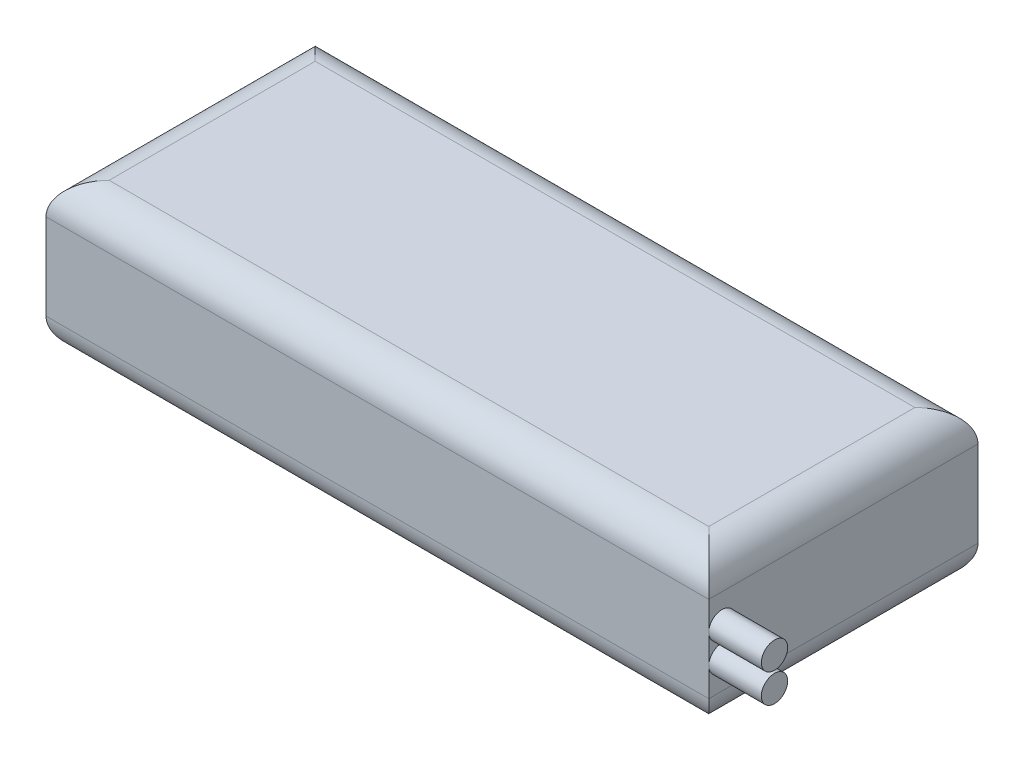
ISO-10303-21;
HEADER;
FILE_DESCRIPTION(('STEP AP214'),'2;1');
FILE_NAME('part.step','',(''),(''),'','','');
FILE_SCHEMA(('AUTOMOTIVE_DESIGN { 1 0 10303 214 1 1 1 1 }'));
ENDSEC;
DATA;
#1=APPLICATION_CONTEXT('core data for automotive mechanical design processes');
#2=APPLICATION_PROTOCOL_DEFINITION('international standard','automotive_design',2000,#1);
#3=PRODUCT_CONTEXT('',#1,'mechanical');
#4=PRODUCT('Part','Part','',(#3));
#5=PRODUCT_RELATED_PRODUCT_CATEGORY('part','',(#4));
#6=PRODUCT_DEFINITION_FORMATION('','',#4);
#7=PRODUCT_DEFINITION_CONTEXT('part definition',#1,'design');
#8=PRODUCT_DEFINITION('design','',#6,#7);
#9=PRODUCT_DEFINITION_SHAPE('','',#8);
#10=(LENGTH_UNIT() NAMED_UNIT(*) SI_UNIT(.MILLI.,.METRE.));
#11=(NAMED_UNIT(*) PLANE_ANGLE_UNIT() SI_UNIT($,.RADIAN.));
#12=(NAMED_UNIT(*) SI_UNIT($,.STERADIAN.) SOLID_ANGLE_UNIT());
#13=UNCERTAINTY_MEASURE_WITH_UNIT(LENGTH_MEASURE(1.E-05),#10,'distance_accuracy_value','');
#14=(GEOMETRIC_REPRESENTATION_CONTEXT(3) GLOBAL_UNCERTAINTY_ASSIGNED_CONTEXT((#13)) GLOBAL_UNIT_ASSIGNED_CONTEXT((#10,
#11,#12)) REPRESENTATION_CONTEXT('',''));
#15=CARTESIAN_POINT('',(0.,0.,0.));
#16=DIRECTION('',(0.,0.,1.));
#17=DIRECTION('',(1.,0.,0.));
#18=AXIS2_PLACEMENT_3D('',#15,#16,#17);
#19=CARTESIAN_POINT('',(-41.0839694656488,36.,-17.2442748091603));
#20=DIRECTION('',(1.,0.,0.));
#21=DIRECTION('',(0.,0.,-1.));
#22=AXIS2_PLACEMENT_3D('',#19,#20,#21);
#23=PLANE('',#22);
#24=DIRECTION('',(0.,-1.,0.));
#25=VECTOR('',#24,1.);
#26=CARTESIAN_POINT('',(-41.0839694656488,36.,-17.2442748091603));
#27=LINE('',#26,#25);
#28=CARTESIAN_POINT('',(-41.0839694656488,28.38,-17.2442748091603));
#29=VERTEX_POINT('',#28);
#30=CARTESIAN_POINT('',(-41.0839694656488,7.62,-17.2442748091603));
#31=VERTEX_POINT('',#30);
#32=EDGE_CURVE('E124',#29,#31,#27,.T.);
#33=ORIENTED_EDGE('',*,*,#32,.T.);
#34=DIRECTION('',(0.,0.,1.));
#35=VECTOR('',#34,1.);
#36=CARTESIAN_POINT('',(-41.0839694656488,7.62,-17.2442748091603));
#37=LINE('',#36,#35);
#38=CARTESIAN_POINT('',(-41.0839694656488,7.62,47.7557251908397));
#39=VERTEX_POINT('',#38);
#40=EDGE_CURVE('E154',#31,#39,#37,.T.);
#41=ORIENTED_EDGE('',*,*,#40,.T.);
#42=DIRECTION('',(0.,-1.,0.));
#43=VECTOR('',#42,1.);
#44=CARTESIAN_POINT('',(-41.0839694656488,36.,47.7557251908397));
#45=LINE('',#44,#43);
#46=CARTESIAN_POINT('',(-41.0839694656488,28.38,47.7557251908397));
#47=VERTEX_POINT('',#46);
#48=EDGE_CURVE('E127',#47,#39,#45,.T.);
#49=ORIENTED_EDGE('',*,*,#48,.F.);
#50=DIRECTION('',(0.,0.,1.));
#51=VECTOR('',#50,1.);
#52=CARTESIAN_POINT('',(-41.0839694656488,28.38,-17.2442748091603));
#53=LINE('',#52,#51);
#54=EDGE_CURVE('E152',#47,#29,#53,.F.);
#55=ORIENTED_EDGE('',*,*,#54,.T.);
#56=EDGE_LOOP('',(#33,#41,#49,#55));
#57=FACE_BOUND('',#56,.T.);
#58=ADVANCED_FACE('F32',(#57),#23,.F.);
#59=CARTESIAN_POINT('',(-41.0839694656488,36.,47.7557251908397));
#60=DIRECTION('',(0.,0.,-1.));
#61=DIRECTION('',(-1.,0.,0.));
#62=AXIS2_PLACEMENT_3D('',#59,#60,#61);
#63=PLANE('',#62);
#64=ORIENTED_EDGE('',*,*,#48,.T.);
#65=DIRECTION('',(1.,0.,0.));
#66=VECTOR('',#65,1.);
#67=CARTESIAN_POINT('',(-41.0839694656488,7.62,47.7557251908397));
#68=LINE('',#67,#66);
#69=CARTESIAN_POINT('',(118.916030534351,7.62,47.7557251908397));
#70=VERTEX_POINT('',#69);
#71=EDGE_CURVE('E121',#39,#70,#68,.T.);
#72=ORIENTED_EDGE('',*,*,#71,.T.);
#73=DIRECTION('',(0.,-1.,0.));
#74=VECTOR('',#73,1.);
#75=CARTESIAN_POINT('',(118.916030534351,36.,47.7557251908397));
#76=LINE('',#75,#74);
#77=CARTESIAN_POINT('',(118.916030534351,14.5075,47.7557251908397));
#78=VERTEX_POINT('',#77);
#79=EDGE_CURVE('E115',#78,#70,#76,.T.);
#80=ORIENTED_EDGE('',*,*,#79,.F.);
#81=CARTESIAN_POINT('',(118.916030534351,21.4925,47.7557251908397));
#82=VERTEX_POINT('',#81);
#83=EDGE_CURVE('E104',#82,#78,#76,.T.);
#84=ORIENTED_EDGE('',*,*,#83,.F.);
#85=CARTESIAN_POINT('',(118.916030534351,28.38,47.7557251908397));
#86=VERTEX_POINT('',#85);
#87=EDGE_CURVE('E114',#86,#82,#76,.T.);
#88=ORIENTED_EDGE('',*,*,#87,.F.);
#89=DIRECTION('',(1.,0.,0.));
#90=VECTOR('',#89,1.);
#91=CARTESIAN_POINT('',(-41.0839694656488,28.38,47.7557251908397));
#92=LINE('',#91,#90);
#93=EDGE_CURVE('E128',#86,#47,#92,.F.);
#94=ORIENTED_EDGE('',*,*,#93,.T.);
#95=EDGE_LOOP('',(#64,#72,#80,#84,#88,#94));
#96=FACE_BOUND('',#95,.T.);
#97=ADVANCED_FACE('F119',(#96),#63,.F.);
#98=CARTESIAN_POINT('',(118.916030534351,36.,-17.2442748091603));
#99=DIRECTION('',(-1.,0.,0.));
#100=DIRECTION('',(0.,0.,1.));
#101=AXIS2_PLACEMENT_3D('',#98,#99,#100);
#102=PLANE('',#101);
#103=ORIENTED_EDGE('',*,*,#79,.T.);
#104=DIRECTION('',(0.,0.,-1.));
#105=VECTOR('',#104,1.);
#106=CARTESIAN_POINT('',(118.916030534351,7.62,-17.2442748091603));
#107=LINE('',#106,#105);
#108=CARTESIAN_POINT('',(118.916030534351,7.62,-17.2442748091603));
#109=VERTEX_POINT('',#108);
#110=EDGE_CURVE('E145',#70,#109,#107,.T.);
#111=ORIENTED_EDGE('',*,*,#110,.T.);
#112=DIRECTION('',(0.,-1.,0.));
#113=VECTOR('',#112,1.);
#114=CARTESIAN_POINT('',(118.916030534351,36.,-17.2442748091603));
#115=LINE('',#114,#113);
#116=CARTESIAN_POINT('',(118.916030534351,28.38,-17.2442748091603));
#117=VERTEX_POINT('',#116);
#118=EDGE_CURVE('E122',#117,#109,#115,.T.);
#119=ORIENTED_EDGE('',*,*,#118,.F.);
#120=DIRECTION('',(0.,0.,-1.));
#121=VECTOR('',#120,1.);
#122=CARTESIAN_POINT('',(118.916030534351,28.38,47.7557251908397));
#123=LINE('',#122,#121);
#124=EDGE_CURVE('E143',#117,#86,#123,.F.);
#125=ORIENTED_EDGE('',*,*,#124,.T.);
#126=ORIENTED_EDGE('',*,*,#87,.T.);
#127=CARTESIAN_POINT('',(118.916030534351,21.4925,44.5807251908397));
#128=DIRECTION('',(1.,0.,0.));
#129=DIRECTION('',(0.,0.,-1.));
#130=AXIS2_PLACEMENT_3D('',#127,#128,#129);
#131=CIRCLE('',#130,3.175);
#132=EDGE_CURVE('E111',#82,#82,#131,.T.);
#133=ORIENTED_EDGE('',*,*,#132,.F.);
#134=ORIENTED_EDGE('',*,*,#83,.T.);
#135=CARTESIAN_POINT('',(118.916030534351,14.5075,44.5807251908397));
#136=DIRECTION('',(1.,0.,0.));
#137=DIRECTION('',(0.,0.,-1.));
#138=AXIS2_PLACEMENT_3D('',#135,#136,#137);
#139=CIRCLE('',#138,3.175);
#140=EDGE_CURVE('E109',#78,#78,#139,.T.);
#141=ORIENTED_EDGE('',*,*,#140,.F.);
#142=EDGE_LOOP('',(#103,#111,#119,#125,#126,#133,#134,#141));
#143=FACE_BOUND('',#142,.T.);
#144=ADVANCED_FACE('F107',(#143),#102,.F.);
#145=CARTESIAN_POINT('',(-41.0839694656488,36.,-17.2442748091603));
#146=DIRECTION('',(0.,0.,1.));
#147=DIRECTION('',(1.,0.,0.));
#148=AXIS2_PLACEMENT_3D('',#145,#146,#147);
#149=PLANE('',#148);
#150=ORIENTED_EDGE('',*,*,#118,.T.);
#151=DIRECTION('',(-1.,0.,0.));
#152=VECTOR('',#151,1.);
#153=CARTESIAN_POINT('',(-41.0839694656488,7.62,-17.2442748091603));
#154=LINE('',#153,#152);
#155=EDGE_CURVE('E150',#109,#31,#154,.T.);
#156=ORIENTED_EDGE('',*,*,#155,.T.);
#157=ORIENTED_EDGE('',*,*,#32,.F.);
#158=DIRECTION('',(-1.,0.,0.));
#159=VECTOR('',#158,1.);
#160=CARTESIAN_POINT('',(118.916030534351,28.38,-17.2442748091603));
#161=LINE('',#160,#159);
#162=EDGE_CURVE('E147',#29,#117,#161,.F.);
#163=ORIENTED_EDGE('',*,*,#162,.T.);
#164=EDGE_LOOP('',(#150,#156,#157,#163));
#165=FACE_BOUND('',#164,.T.);
#166=ADVANCED_FACE('F205',(#165),#149,.F.);
#167=CARTESIAN_POINT('',(0.,36.,0.));
#168=DIRECTION('',(0.,1.,0.));
#169=DIRECTION('',(0.,0.,1.));
#170=AXIS2_PLACEMENT_3D('',#167,#168,#169);
#171=PLANE('',#170);
#172=DIRECTION('',(0.,0.,-1.));
#173=VECTOR('',#172,1.);
#174=CARTESIAN_POINT('',(111.296030534351,36.,-17.2442748091603));
#175=LINE('',#174,#173);
#176=CARTESIAN_POINT('',(111.296030534351,36.,40.1357251908397));
#177=VERTEX_POINT('',#176);
#178=CARTESIAN_POINT('',(111.296030534351,36.,-9.62427480916031));
#179=VERTEX_POINT('',#178);
#180=EDGE_CURVE('E41',#177,#179,#175,.T.);
#181=ORIENTED_EDGE('',*,*,#180,.T.);
#182=DIRECTION('',(-1.,0.,0.));
#183=VECTOR('',#182,1.);
#184=CARTESIAN_POINT('',(-41.0839694656488,36.,-9.62427480916031));
#185=LINE('',#184,#183);
#186=CARTESIAN_POINT('',(-33.4639694656488,36.,-9.62427480916031));
#187=VERTEX_POINT('',#186);
#188=EDGE_CURVE('E11',#179,#187,#185,.T.);
#189=ORIENTED_EDGE('',*,*,#188,.T.);
#190=DIRECTION('',(0.,0.,1.));
#191=VECTOR('',#190,1.);
#192=CARTESIAN_POINT('',(-33.4639694656488,36.,47.7557251908397));
#193=LINE('',#192,#191);
#194=CARTESIAN_POINT('',(-33.4639694656488,36.,40.1357251908397));
#195=VERTEX_POINT('',#194);
#196=EDGE_CURVE('E156',#187,#195,#193,.T.);
#197=ORIENTED_EDGE('',*,*,#196,.T.);
#198=DIRECTION('',(1.,0.,0.));
#199=VECTOR('',#198,1.);
#200=CARTESIAN_POINT('',(118.916030534351,36.,40.1357251908397));
#201=LINE('',#200,#199);
#202=EDGE_CURVE('E52',#195,#177,#201,.T.);
#203=ORIENTED_EDGE('',*,*,#202,.T.);
#204=EDGE_LOOP('',(#181,#189,#197,#203));
#205=FACE_BOUND('',#204,.T.);
#206=ADVANCED_FACE('F214',(#205),#171,.T.);
#207=CARTESIAN_POINT('',(0.,0.,0.));
#208=DIRECTION('',(0.,1.,0.));
#209=DIRECTION('',(0.,0.,1.));
#210=AXIS2_PLACEMENT_3D('',#207,#208,#209);
#211=PLANE('',#210);
#212=DIRECTION('',(0.,0.,-1.));
#213=VECTOR('',#212,1.);
#214=CARTESIAN_POINT('',(111.296030534351,0.,0.));
#215=LINE('',#214,#213);
#216=CARTESIAN_POINT('',(111.296030534351,0.,-9.62427480916031));
#217=VERTEX_POINT('',#216);
#218=CARTESIAN_POINT('',(111.296030534351,0.,40.1357251908397));
#219=VERTEX_POINT('',#218);
#220=EDGE_CURVE('E138',#217,#219,#215,.F.);
#221=ORIENTED_EDGE('',*,*,#220,.T.);
#222=DIRECTION('',(1.,0.,0.));
#223=VECTOR('',#222,1.);
#224=CARTESIAN_POINT('',(0.,0.,40.1357251908397));
#225=LINE('',#224,#223);
#226=CARTESIAN_POINT('',(-33.4639694656488,0.,40.1357251908397));
#227=VERTEX_POINT('',#226);
#228=EDGE_CURVE('E140',#219,#227,#225,.F.);
#229=ORIENTED_EDGE('',*,*,#228,.T.);
#230=DIRECTION('',(0.,0.,1.));
#231=VECTOR('',#230,1.);
#232=CARTESIAN_POINT('',(-33.4639694656488,0.,0.));
#233=LINE('',#232,#231);
#234=CARTESIAN_POINT('',(-33.4639694656488,0.,-9.62427480916031));
#235=VERTEX_POINT('',#234);
#236=EDGE_CURVE('E134',#227,#235,#233,.F.);
#237=ORIENTED_EDGE('',*,*,#236,.T.);
#238=DIRECTION('',(-1.,0.,0.));
#239=VECTOR('',#238,1.);
#240=CARTESIAN_POINT('',(0.,0.,-9.62427480916031));
#241=LINE('',#240,#239);
#242=EDGE_CURVE('E136',#235,#217,#241,.F.);
#243=ORIENTED_EDGE('',*,*,#242,.T.);
#244=EDGE_LOOP('',(#221,#229,#237,#243));
#245=FACE_BOUND('',#244,.T.);
#246=ADVANCED_FACE('F211',(#245),#211,.F.);
#247=CARTESIAN_POINT('',(131.616030534351,21.4925,44.5807251908397));
#248=DIRECTION('',(-1.,0.,0.));
#249=DIRECTION('',(0.,0.,1.));
#250=AXIS2_PLACEMENT_3D('',#247,#248,#249);
#251=CYLINDRICAL_SURFACE('',#250,3.175);
#252=CARTESIAN_POINT('',(131.616030534351,21.4925,44.5807251908397));
#253=DIRECTION('',(1.,0.,0.));
#254=DIRECTION('',(0.,0.,-1.));
#255=AXIS2_PLACEMENT_3D('',#252,#253,#254);
#256=CIRCLE('',#255,3.175);
#257=CARTESIAN_POINT('',(131.616030534351,21.4925,41.4057251908397));
#258=VERTEX_POINT('',#257);
#259=EDGE_CURVE('E368',#258,#258,#256,.T.);
#260=ORIENTED_EDGE('',*,*,#259,.F.);
#261=EDGE_LOOP('',(#260));
#262=FACE_BOUND('',#261,.T.);
#263=ORIENTED_EDGE('',*,*,#132,.T.);
#264=EDGE_LOOP('',(#263));
#265=FACE_BOUND('',#264,.T.);
#266=ADVANCED_FACE('F213',(#262,#265),#251,.T.);
#267=CARTESIAN_POINT('',(131.616030534351,21.4925,44.5807251908397));
#268=DIRECTION('',(1.,0.,0.));
#269=DIRECTION('',(0.,0.,-1.));
#270=AXIS2_PLACEMENT_3D('',#267,#268,#269);
#271=PLANE('',#270);
#272=ORIENTED_EDGE('',*,*,#259,.T.);
#273=EDGE_LOOP('',(#272));
#274=FACE_BOUND('',#273,.T.);
#275=ADVANCED_FACE('F220',(#274),#271,.T.);
#276=CARTESIAN_POINT('',(131.616030534351,14.5075,44.5807251908397));
#277=DIRECTION('',(-1.,0.,0.));
#278=DIRECTION('',(0.,0.,1.));
#279=AXIS2_PLACEMENT_3D('',#276,#277,#278);
#280=CYLINDRICAL_SURFACE('',#279,3.175);
#281=CARTESIAN_POINT('',(131.616030534351,14.5075,44.5807251908397));
#282=DIRECTION('',(1.,0.,0.));
#283=DIRECTION('',(0.,0.,-1.));
#284=AXIS2_PLACEMENT_3D('',#281,#282,#283);
#285=CIRCLE('',#284,3.175);
#286=CARTESIAN_POINT('',(131.616030534351,14.5075,41.4057251908397));
#287=VERTEX_POINT('',#286);
#288=EDGE_CURVE('E371',#287,#287,#285,.T.);
#289=ORIENTED_EDGE('',*,*,#288,.F.);
#290=EDGE_LOOP('',(#289));
#291=FACE_BOUND('',#290,.T.);
#292=ORIENTED_EDGE('',*,*,#140,.T.);
#293=EDGE_LOOP('',(#292));
#294=FACE_BOUND('',#293,.T.);
#295=ADVANCED_FACE('F276',(#291,#294),#280,.T.);
#296=CARTESIAN_POINT('',(131.616030534351,14.5075,44.5807251908397));
#297=DIRECTION('',(1.,0.,0.));
#298=DIRECTION('',(0.,0.,-1.));
#299=AXIS2_PLACEMENT_3D('',#296,#297,#298);
#300=PLANE('',#299);
#301=ORIENTED_EDGE('',*,*,#288,.T.);
#302=EDGE_LOOP('',(#301));
#303=FACE_BOUND('',#302,.T.);
#304=ADVANCED_FACE('F241',(#303),#300,.T.);
#305=CARTESIAN_POINT('',(-41.0839694656488,7.62,-9.62427480916031));
#306=DIRECTION('',(-1.,0.,0.));
#307=DIRECTION('',(0.,0.,1.));
#308=AXIS2_PLACEMENT_3D('',#305,#306,#307);
#309=CYLINDRICAL_SURFACE('',#308,7.62);
#310=CARTESIAN_POINT('',(111.296030534351,7.62,-9.62427480916031));
#311=DIRECTION('',(-0.707106781186547,0.,-0.707106781186547));
#312=DIRECTION('',(-0.707106781186547,0.,0.707106781186547));
#313=AXIS2_PLACEMENT_3D('',#310,#311,#312);
#314=ELLIPSE('',#313,10.776307345283,7.62);
#315=EDGE_CURVE('E164',#217,#109,#314,.F.);
#316=ORIENTED_EDGE('',*,*,#315,.F.);
#317=ORIENTED_EDGE('',*,*,#242,.F.);
#318=CARTESIAN_POINT('',(-33.4639694656488,7.62,-9.62427480916031));
#319=DIRECTION('',(-0.707106781186547,0.,0.707106781186547));
#320=DIRECTION('',(0.707106781186547,0.,0.707106781186547));
#321=AXIS2_PLACEMENT_3D('',#318,#319,#320);
#322=ELLIPSE('',#321,10.776307345283,7.62);
#323=EDGE_CURVE('E167',#31,#235,#322,.T.);
#324=ORIENTED_EDGE('',*,*,#323,.F.);
#325=ORIENTED_EDGE('',*,*,#155,.F.);
#326=EDGE_LOOP('',(#316,#317,#324,#325));
#327=FACE_BOUND('',#326,.T.);
#328=ADVANCED_FACE('F208',(#327),#309,.T.);
#329=CARTESIAN_POINT('',(-33.4639694656488,7.62,-17.2442748091603));
#330=DIRECTION('',(0.,0.,1.));
#331=DIRECTION('',(1.,0.,0.));
#332=AXIS2_PLACEMENT_3D('',#329,#330,#331);
#333=CYLINDRICAL_SURFACE('',#332,7.62);
#334=ORIENTED_EDGE('',*,*,#323,.T.);
#335=ORIENTED_EDGE('',*,*,#236,.F.);
#336=CARTESIAN_POINT('',(-33.4639694656488,7.62,40.1357251908397));
#337=DIRECTION('',(0.707106781186547,0.,0.707106781186547));
#338=DIRECTION('',(-0.707106781186547,0.,0.707106781186547));
#339=AXIS2_PLACEMENT_3D('',#336,#337,#338);
#340=ELLIPSE('',#339,10.776307345283,7.62);
#341=EDGE_CURVE('E162',#39,#227,#340,.T.);
#342=ORIENTED_EDGE('',*,*,#341,.F.);
#343=ORIENTED_EDGE('',*,*,#40,.F.);
#344=EDGE_LOOP('',(#334,#335,#342,#343));
#345=FACE_BOUND('',#344,.T.);
#346=ADVANCED_FACE('F191',(#345),#333,.T.);
#347=CARTESIAN_POINT('',(111.296030534351,7.62,-17.2442748091603));
#348=DIRECTION('',(0.,0.,-1.));
#349=DIRECTION('',(-1.,0.,0.));
#350=AXIS2_PLACEMENT_3D('',#347,#348,#349);
#351=CYLINDRICAL_SURFACE('',#350,7.62);
#352=ORIENTED_EDGE('',*,*,#315,.T.);
#353=ORIENTED_EDGE('',*,*,#110,.F.);
#354=CARTESIAN_POINT('',(111.296030534351,7.62,40.1357251908397));
#355=DIRECTION('',(0.707106781186547,0.,-0.707106781186547));
#356=DIRECTION('',(-0.707106781186547,0.,-0.707106781186547));
#357=AXIS2_PLACEMENT_3D('',#354,#355,#356);
#358=ELLIPSE('',#357,10.776307345283,7.62);
#359=EDGE_CURVE('E160',#219,#70,#358,.F.);
#360=ORIENTED_EDGE('',*,*,#359,.F.);
#361=ORIENTED_EDGE('',*,*,#220,.F.);
#362=EDGE_LOOP('',(#352,#353,#360,#361));
#363=FACE_BOUND('',#362,.T.);
#364=ADVANCED_FACE('F200',(#363),#351,.T.);
#365=CARTESIAN_POINT('',(-41.0839694656488,7.62,40.1357251908397));
#366=DIRECTION('',(1.,0.,0.));
#367=DIRECTION('',(0.,0.,-1.));
#368=AXIS2_PLACEMENT_3D('',#365,#366,#367);
#369=CYLINDRICAL_SURFACE('',#368,7.62);
#370=ORIENTED_EDGE('',*,*,#341,.T.);
#371=ORIENTED_EDGE('',*,*,#228,.F.);
#372=ORIENTED_EDGE('',*,*,#359,.T.);
#373=ORIENTED_EDGE('',*,*,#71,.F.);
#374=EDGE_LOOP('',(#370,#371,#372,#373));
#375=FACE_BOUND('',#374,.T.);
#376=ADVANCED_FACE('F195',(#375),#369,.T.);
#377=CARTESIAN_POINT('',(0.,28.38,40.1357251908397));
#378=DIRECTION('',(-1.,0.,0.));
#379=DIRECTION('',(0.,0.,1.));
#380=AXIS2_PLACEMENT_3D('',#377,#378,#379);
#381=CYLINDRICAL_SURFACE('',#380,7.62);
#382=CARTESIAN_POINT('',(-33.4639694656488,28.38,40.1357251908397));
#383=DIRECTION('',(-0.707106781186547,0.,-0.707106781186547));
#384=DIRECTION('',(0.707106781186547,0.,-0.707106781186547));
#385=AXIS2_PLACEMENT_3D('',#382,#383,#384);
#386=ELLIPSE('',#385,10.776307345283,7.62);
#387=EDGE_CURVE('E173',#47,#195,#386,.T.);
#388=ORIENTED_EDGE('',*,*,#387,.F.);
#389=ORIENTED_EDGE('',*,*,#93,.F.);
#390=CARTESIAN_POINT('',(111.296030534351,28.38,40.1357251908397));
#391=DIRECTION('',(-0.707106781186547,0.,0.707106781186547));
#392=DIRECTION('',(-0.707106781186547,0.,-0.707106781186547));
#393=AXIS2_PLACEMENT_3D('',#390,#391,#392);
#394=ELLIPSE('',#393,10.776307345283,7.62);
#395=EDGE_CURVE('E36',#177,#86,#394,.F.);
#396=ORIENTED_EDGE('',*,*,#395,.F.);
#397=ORIENTED_EDGE('',*,*,#202,.F.);
#398=EDGE_LOOP('',(#388,#389,#396,#397));
#399=FACE_BOUND('',#398,.T.);
#400=ADVANCED_FACE('F34',(#399),#381,.T.);
#401=CARTESIAN_POINT('',(111.296030534351,28.38,0.));
#402=DIRECTION('',(0.,0.,1.));
#403=DIRECTION('',(1.,0.,0.));
#404=AXIS2_PLACEMENT_3D('',#401,#402,#403);
#405=CYLINDRICAL_SURFACE('',#404,7.62);
#406=ORIENTED_EDGE('',*,*,#395,.T.);
#407=ORIENTED_EDGE('',*,*,#124,.F.);
#408=CARTESIAN_POINT('',(111.296030534351,28.38,-9.62427480916031));
#409=DIRECTION('',(0.707106781186547,0.,0.707106781186547));
#410=DIRECTION('',(-0.707106781186547,0.,0.707106781186547));
#411=AXIS2_PLACEMENT_3D('',#408,#409,#410);
#412=ELLIPSE('',#411,10.776307345283,7.62);
#413=EDGE_CURVE('E172',#179,#117,#412,.F.);
#414=ORIENTED_EDGE('',*,*,#413,.F.);
#415=ORIENTED_EDGE('',*,*,#180,.F.);
#416=EDGE_LOOP('',(#406,#407,#414,#415));
#417=FACE_BOUND('',#416,.T.);
#418=ADVANCED_FACE('F182',(#417),#405,.T.);
#419=CARTESIAN_POINT('',(-33.4639694656488,28.38,0.));
#420=DIRECTION('',(0.,0.,-1.));
#421=DIRECTION('',(-1.,0.,0.));
#422=AXIS2_PLACEMENT_3D('',#419,#420,#421);
#423=CYLINDRICAL_SURFACE('',#422,7.62);
#424=ORIENTED_EDGE('',*,*,#387,.T.);
#425=ORIENTED_EDGE('',*,*,#196,.F.);
#426=CARTESIAN_POINT('',(-33.4639694656488,28.38,-9.62427480916031));
#427=DIRECTION('',(0.707106781186547,0.,-0.707106781186547));
#428=DIRECTION('',(-0.707106781186547,0.,-0.707106781186547));
#429=AXIS2_PLACEMENT_3D('',#426,#427,#428);
#430=ELLIPSE('',#429,10.776307345283,7.62);
#431=EDGE_CURVE('E170',#29,#187,#430,.T.);
#432=ORIENTED_EDGE('',*,*,#431,.F.);
#433=ORIENTED_EDGE('',*,*,#54,.F.);
#434=EDGE_LOOP('',(#424,#425,#432,#433));
#435=FACE_BOUND('',#434,.T.);
#436=ADVANCED_FACE('F245',(#435),#423,.T.);
#437=CARTESIAN_POINT('',(0.,28.38,-9.62427480916031));
#438=DIRECTION('',(1.,0.,0.));
#439=DIRECTION('',(0.,0.,-1.));
#440=AXIS2_PLACEMENT_3D('',#437,#438,#439);
#441=CYLINDRICAL_SURFACE('',#440,7.62);
#442=ORIENTED_EDGE('',*,*,#413,.T.);
#443=ORIENTED_EDGE('',*,*,#162,.F.);
#444=ORIENTED_EDGE('',*,*,#431,.T.);
#445=ORIENTED_EDGE('',*,*,#188,.F.);
#446=EDGE_LOOP('',(#442,#443,#444,#445));
#447=FACE_BOUND('',#446,.T.);
#448=ADVANCED_FACE('F242',(#447),#441,.T.);
#449=CLOSED_SHELL('',(#58,#97,#144,#166,#206,#246,#266,#275,#295,#304,#328,#346,#364,#376,#400,
#418,#436,#448));
#450=MANIFOLD_SOLID_BREP('B2',#449);
#451=ADVANCED_BREP_SHAPE_REPRESENTATION('',(#18,#450),#14);
#452=SHAPE_DEFINITION_REPRESENTATION(#9,#451);
ENDSEC;
END-ISO-10303-21;
